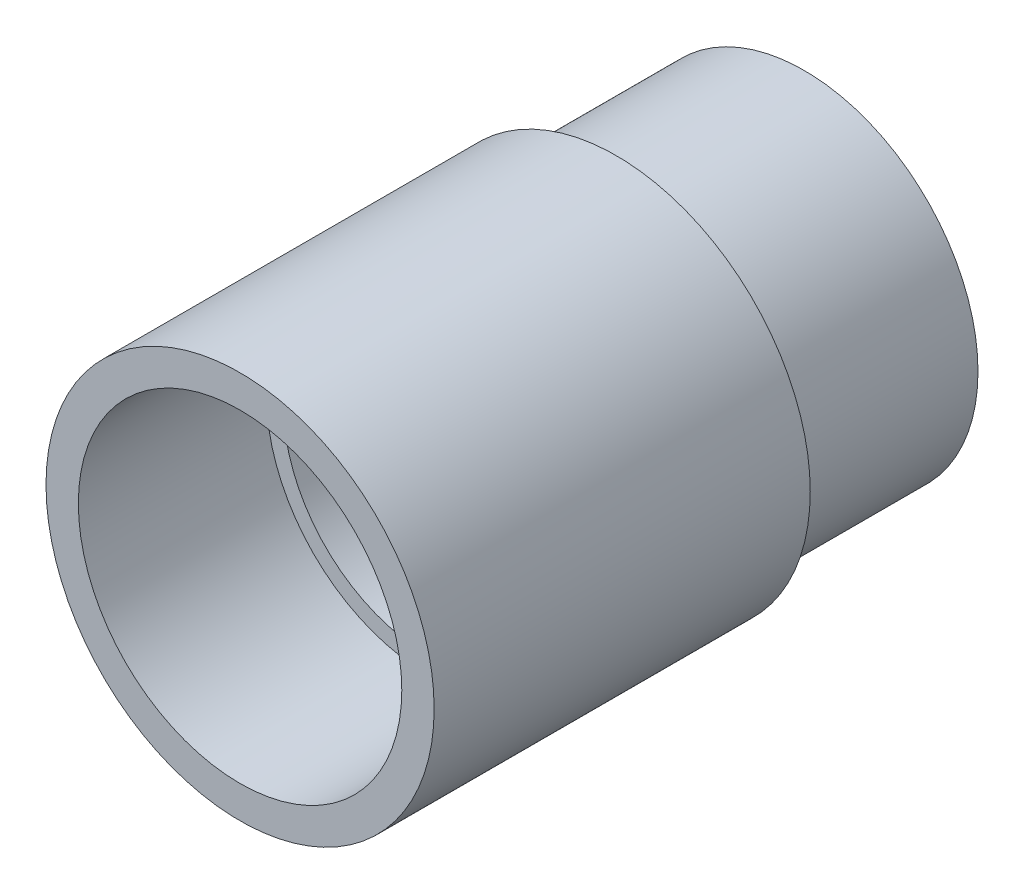
ISO-10303-21;
HEADER;
FILE_DESCRIPTION(('STEP AP214'),'2;1');
FILE_NAME('part.step','',(''),(''),'','','');
FILE_SCHEMA(('AUTOMOTIVE_DESIGN { 1 0 10303 214 1 1 1 1 }'));
ENDSEC;
DATA;
#1=APPLICATION_CONTEXT('core data for automotive mechanical design processes');
#2=APPLICATION_PROTOCOL_DEFINITION('international standard','automotive_design',2000,#1);
#3=PRODUCT_CONTEXT('',#1,'mechanical');
#4=PRODUCT('Part','Part','',(#3));
#5=PRODUCT_RELATED_PRODUCT_CATEGORY('part','',(#4));
#6=PRODUCT_DEFINITION_FORMATION('','',#4);
#7=PRODUCT_DEFINITION_CONTEXT('part definition',#1,'design');
#8=PRODUCT_DEFINITION('design','',#6,#7);
#9=PRODUCT_DEFINITION_SHAPE('','',#8);
#10=(LENGTH_UNIT() NAMED_UNIT(*) SI_UNIT(.MILLI.,.METRE.));
#11=(NAMED_UNIT(*) PLANE_ANGLE_UNIT() SI_UNIT($,.RADIAN.));
#12=(NAMED_UNIT(*) SI_UNIT($,.STERADIAN.) SOLID_ANGLE_UNIT());
#13=UNCERTAINTY_MEASURE_WITH_UNIT(LENGTH_MEASURE(1.E-05),#10,'distance_accuracy_value','');
#14=(GEOMETRIC_REPRESENTATION_CONTEXT(3) GLOBAL_UNCERTAINTY_ASSIGNED_CONTEXT((#13)) GLOBAL_UNIT_ASSIGNED_CONTEXT((#10,
#11,#12)) REPRESENTATION_CONTEXT('',''));
#15=CARTESIAN_POINT('',(0.,0.,0.));
#16=DIRECTION('',(0.,0.,1.));
#17=DIRECTION('',(1.,0.,0.));
#18=AXIS2_PLACEMENT_3D('',#15,#16,#17);
#19=CARTESIAN_POINT('',(0.,0.,40.));
#20=DIRECTION('',(0.,0.,1.));
#21=DIRECTION('',(1.,0.,0.));
#22=AXIS2_PLACEMENT_3D('',#19,#20,#21);
#23=PLANE('',#22);
#24=CARTESIAN_POINT('',(0.,0.,40.));
#25=DIRECTION('',(0.,0.,1.));
#26=DIRECTION('',(1.,0.,0.));
#27=AXIS2_PLACEMENT_3D('',#24,#25,#26);
#28=CIRCLE('',#27,15.4);
#29=CARTESIAN_POINT('',(15.4,0.,40.));
#30=VERTEX_POINT('',#29);
#31=EDGE_CURVE('E55',#30,#30,#28,.T.);
#32=ORIENTED_EDGE('',*,*,#31,.F.);
#33=EDGE_LOOP('',(#32));
#34=FACE_BOUND('',#33,.T.);
#35=CARTESIAN_POINT('',(0.,0.,40.));
#36=DIRECTION('',(0.,0.,1.));
#37=DIRECTION('',(1.,0.,0.));
#38=AXIS2_PLACEMENT_3D('',#35,#36,#37);
#39=CIRCLE('',#38,17.2);
#40=CARTESIAN_POINT('',(17.2,0.,40.));
#41=VERTEX_POINT('',#40);
#42=EDGE_CURVE('E10',#41,#41,#39,.F.);
#43=ORIENTED_EDGE('',*,*,#42,.F.);
#44=EDGE_LOOP('',(#43));
#45=FACE_BOUND('',#44,.T.);
#46=ADVANCED_FACE('F37',(#34,#45),#23,.T.);
#47=CARTESIAN_POINT('',(0.,0.,40.));
#48=DIRECTION('',(0.,0.,-1.));
#49=DIRECTION('',(-1.,0.,0.));
#50=AXIS2_PLACEMENT_3D('',#47,#48,#49);
#51=CYLINDRICAL_SURFACE('',#50,18.48);
#52=CARTESIAN_POINT('',(0.,0.,0.));
#53=DIRECTION('',(0.,0.,1.));
#54=DIRECTION('',(1.,0.,0.));
#55=AXIS2_PLACEMENT_3D('',#52,#53,#54);
#56=CIRCLE('',#55,18.48);
#57=CARTESIAN_POINT('',(18.48,0.,0.));
#58=VERTEX_POINT('',#57);
#59=EDGE_CURVE('E50',#58,#58,#56,.T.);
#60=ORIENTED_EDGE('',*,*,#59,.T.);
#61=EDGE_LOOP('',(#60));
#62=FACE_BOUND('',#61,.T.);
#63=CARTESIAN_POINT('',(0.,0.,20.));
#64=DIRECTION('',(0.,0.,1.));
#65=DIRECTION('',(1.,0.,0.));
#66=AXIS2_PLACEMENT_3D('',#63,#64,#65);
#67=CIRCLE('',#66,18.48);
#68=CARTESIAN_POINT('',(18.48,0.,20.));
#69=VERTEX_POINT('',#68);
#70=EDGE_CURVE('E45',#69,#69,#67,.T.);
#71=ORIENTED_EDGE('',*,*,#70,.F.);
#72=EDGE_LOOP('',(#71));
#73=FACE_BOUND('',#72,.T.);
#74=ADVANCED_FACE('F39',(#62,#73),#51,.T.);
#75=CARTESIAN_POINT('',(0.,0.,0.));
#76=DIRECTION('',(0.,0.,1.));
#77=DIRECTION('',(1.,0.,0.));
#78=AXIS2_PLACEMENT_3D('',#75,#76,#77);
#79=PLANE('',#78);
#80=ORIENTED_EDGE('',*,*,#59,.F.);
#81=EDGE_LOOP('',(#80));
#82=FACE_BOUND('',#81,.T.);
#83=CARTESIAN_POINT('',(0.,0.,0.));
#84=DIRECTION('',(0.,0.,1.));
#85=DIRECTION('',(1.,0.,0.));
#86=AXIS2_PLACEMENT_3D('',#83,#84,#85);
#87=CIRCLE('',#86,15.4);
#88=CARTESIAN_POINT('',(15.4,0.,0.));
#89=VERTEX_POINT('',#88);
#90=EDGE_CURVE('E58',#89,#89,#87,.T.);
#91=ORIENTED_EDGE('',*,*,#90,.T.);
#92=EDGE_LOOP('',(#91));
#93=FACE_BOUND('',#92,.T.);
#94=ADVANCED_FACE('F92',(#82,#93),#79,.F.);
#95=CARTESIAN_POINT('',(0.,0.,40.));
#96=DIRECTION('',(0.,0.,-1.));
#97=DIRECTION('',(-1.,0.,0.));
#98=AXIS2_PLACEMENT_3D('',#95,#96,#97);
#99=CYLINDRICAL_SURFACE('',#98,15.4);
#100=ORIENTED_EDGE('',*,*,#31,.T.);
#101=EDGE_LOOP('',(#100));
#102=FACE_BOUND('',#101,.T.);
#103=ORIENTED_EDGE('',*,*,#90,.F.);
#104=EDGE_LOOP('',(#103));
#105=FACE_BOUND('',#104,.T.);
#106=ADVANCED_FACE('F83',(#102,#105),#99,.F.);
#107=CARTESIAN_POINT('',(0.,0.,60.));
#108=DIRECTION('',(0.,0.,1.));
#109=DIRECTION('',(1.,0.,0.));
#110=AXIS2_PLACEMENT_3D('',#107,#108,#109);
#111=PLANE('',#110);
#112=CARTESIAN_POINT('',(0.,0.,60.));
#113=DIRECTION('',(0.,0.,1.));
#114=DIRECTION('',(1.,0.,0.));
#115=AXIS2_PLACEMENT_3D('',#112,#113,#114);
#116=CIRCLE('',#115,20.64);
#117=CARTESIAN_POINT('',(20.64,0.,60.));
#118=VERTEX_POINT('',#117);
#119=EDGE_CURVE('E62',#118,#118,#116,.T.);
#120=ORIENTED_EDGE('',*,*,#119,.T.);
#121=EDGE_LOOP('',(#120));
#122=FACE_BOUND('',#121,.T.);
#123=CARTESIAN_POINT('',(0.,0.,60.));
#124=DIRECTION('',(0.,0.,1.));
#125=DIRECTION('',(1.,0.,0.));
#126=AXIS2_PLACEMENT_3D('',#123,#124,#125);
#127=CIRCLE('',#126,17.2);
#128=CARTESIAN_POINT('',(17.2,0.,60.));
#129=VERTEX_POINT('',#128);
#130=EDGE_CURVE('E70',#129,#129,#127,.T.);
#131=ORIENTED_EDGE('',*,*,#130,.F.);
#132=EDGE_LOOP('',(#131));
#133=FACE_BOUND('',#132,.T.);
#134=ADVANCED_FACE('F80',(#122,#133),#111,.T.);
#135=CARTESIAN_POINT('',(0.,0.,20.));
#136=DIRECTION('',(0.,0.,1.));
#137=DIRECTION('',(1.,0.,0.));
#138=AXIS2_PLACEMENT_3D('',#135,#136,#137);
#139=PLANE('',#138);
#140=ORIENTED_EDGE('',*,*,#70,.T.);
#141=EDGE_LOOP('',(#140));
#142=FACE_BOUND('',#141,.T.);
#143=CARTESIAN_POINT('',(0.,0.,20.));
#144=DIRECTION('',(0.,0.,1.));
#145=DIRECTION('',(1.,0.,0.));
#146=AXIS2_PLACEMENT_3D('',#143,#144,#145);
#147=CIRCLE('',#146,20.64);
#148=CARTESIAN_POINT('',(20.64,0.,20.));
#149=VERTEX_POINT('',#148);
#150=EDGE_CURVE('E66',#149,#149,#147,.T.);
#151=ORIENTED_EDGE('',*,*,#150,.F.);
#152=EDGE_LOOP('',(#151));
#153=FACE_BOUND('',#152,.T.);
#154=ADVANCED_FACE('F82',(#142,#153),#139,.F.);
#155=CARTESIAN_POINT('',(0.,0.,60.));
#156=DIRECTION('',(0.,0.,-1.));
#157=DIRECTION('',(-1.,0.,0.));
#158=AXIS2_PLACEMENT_3D('',#155,#156,#157);
#159=CYLINDRICAL_SURFACE('',#158,20.64);
#160=ORIENTED_EDGE('',*,*,#119,.F.);
#161=EDGE_LOOP('',(#160));
#162=FACE_BOUND('',#161,.T.);
#163=ORIENTED_EDGE('',*,*,#150,.T.);
#164=EDGE_LOOP('',(#163));
#165=FACE_BOUND('',#164,.T.);
#166=ADVANCED_FACE('F90',(#162,#165),#159,.T.);
#167=CARTESIAN_POINT('',(0.,0.,60.));
#168=DIRECTION('',(0.,0.,-1.));
#169=DIRECTION('',(-1.,0.,0.));
#170=AXIS2_PLACEMENT_3D('',#167,#168,#169);
#171=CYLINDRICAL_SURFACE('',#170,17.2);
#172=ORIENTED_EDGE('',*,*,#42,.T.);
#173=EDGE_LOOP('',(#172));
#174=FACE_BOUND('',#173,.T.);
#175=ORIENTED_EDGE('',*,*,#130,.T.);
#176=EDGE_LOOP('',(#175));
#177=FACE_BOUND('',#176,.T.);
#178=ADVANCED_FACE('F78',(#174,#177),#171,.F.);
#179=CLOSED_SHELL('',(#46,#74,#94,#106,#134,#154,#166,#178));
#180=MANIFOLD_SOLID_BREP('B2',#179);
#181=ADVANCED_BREP_SHAPE_REPRESENTATION('',(#18,#180),#14);
#182=SHAPE_DEFINITION_REPRESENTATION(#9,#181);
ENDSEC;
END-ISO-10303-21;
